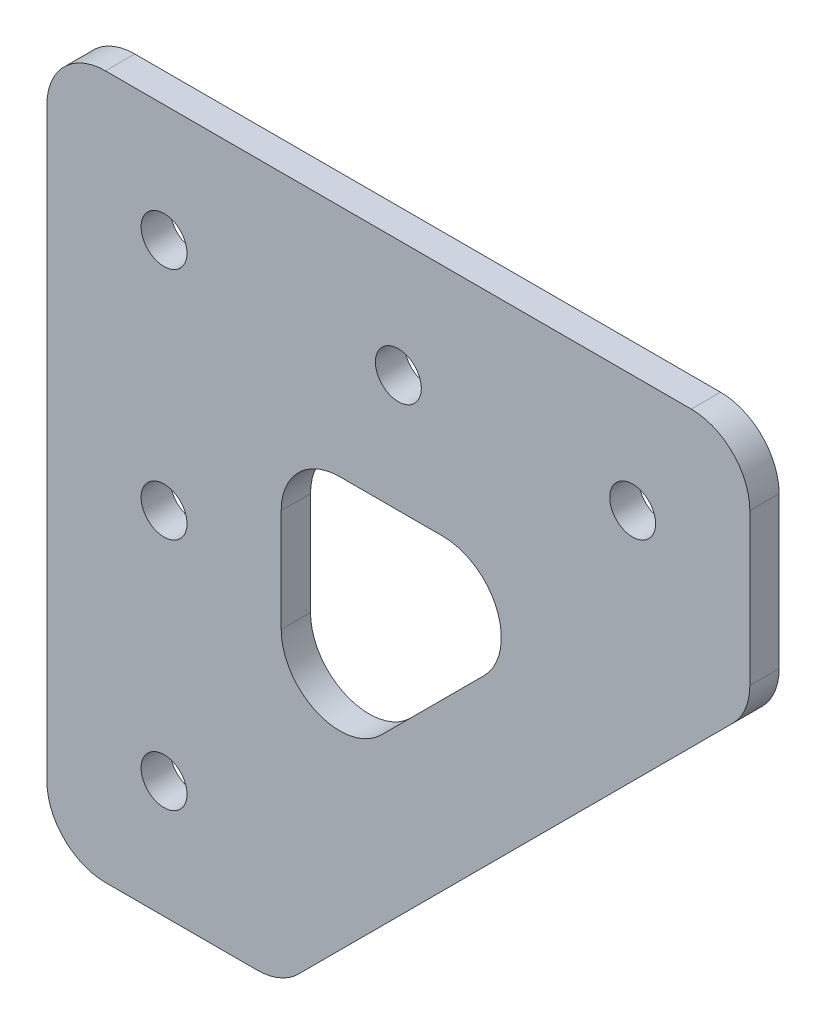
ISO-10303-21;
HEADER;
FILE_DESCRIPTION(('STEP AP214'),'2;1');
FILE_NAME('part.step','',(''),(''),'','','');
FILE_SCHEMA(('AUTOMOTIVE_DESIGN { 1 0 10303 214 1 1 1 1 }'));
ENDSEC;
DATA;
#1=APPLICATION_CONTEXT('core data for automotive mechanical design processes');
#2=APPLICATION_PROTOCOL_DEFINITION('international standard','automotive_design',2000,#1);
#3=PRODUCT_CONTEXT('',#1,'mechanical');
#4=PRODUCT('Part','Part','',(#3));
#5=PRODUCT_RELATED_PRODUCT_CATEGORY('part','',(#4));
#6=PRODUCT_DEFINITION_FORMATION('','',#4);
#7=PRODUCT_DEFINITION_CONTEXT('part definition',#1,'design');
#8=PRODUCT_DEFINITION('design','',#6,#7);
#9=PRODUCT_DEFINITION_SHAPE('','',#8);
#10=(LENGTH_UNIT() NAMED_UNIT(*) SI_UNIT(.MILLI.,.METRE.));
#11=(NAMED_UNIT(*) PLANE_ANGLE_UNIT() SI_UNIT($,.RADIAN.));
#12=(NAMED_UNIT(*) SI_UNIT($,.STERADIAN.) SOLID_ANGLE_UNIT());
#13=UNCERTAINTY_MEASURE_WITH_UNIT(LENGTH_MEASURE(1.E-05),#10,'distance_accuracy_value','');
#14=(GEOMETRIC_REPRESENTATION_CONTEXT(3) GLOBAL_UNCERTAINTY_ASSIGNED_CONTEXT((#13)) GLOBAL_UNIT_ASSIGNED_CONTEXT((#10,
#11,#12)) REPRESENTATION_CONTEXT('',''));
#15=CARTESIAN_POINT('',(0.,0.,0.));
#16=DIRECTION('',(0.,0.,1.));
#17=DIRECTION('',(1.,0.,0.));
#18=AXIS2_PLACEMENT_3D('',#15,#16,#17);
#19=CARTESIAN_POINT('',(0.,50.8,-3.175));
#20=DIRECTION('',(0.,1.,0.));
#21=DIRECTION('',(-1.,0.,0.));
#22=AXIS2_PLACEMENT_3D('',#19,#20,#21);
#23=PLANE('',#22);
#24=DIRECTION('',(-1.,0.,0.));
#25=VECTOR('',#24,1.);
#26=CARTESIAN_POINT('',(0.,50.8,-3.175));
#27=LINE('',#26,#25);
#28=CARTESIAN_POINT('',(42.9092316367925,50.8,-3.175));
#29=VERTEX_POINT('',#28);
#30=CARTESIAN_POINT('',(31.75,50.8,-3.175));
#31=VERTEX_POINT('',#30);
#32=EDGE_CURVE('E174',#29,#31,#27,.T.);
#33=ORIENTED_EDGE('',*,*,#32,.F.);
#34=DIRECTION('',(0.,0.,1.));
#35=VECTOR('',#34,1.);
#36=CARTESIAN_POINT('',(42.9092316367925,50.8,-3.175));
#37=LINE('',#36,#35);
#38=CARTESIAN_POINT('',(42.9092316367925,50.8,0.));
#39=VERTEX_POINT('',#38);
#40=EDGE_CURVE('E159',#29,#39,#37,.T.);
#41=ORIENTED_EDGE('',*,*,#40,.T.);
#42=DIRECTION('',(-1.,0.,0.));
#43=VECTOR('',#42,1.);
#44=CARTESIAN_POINT('',(0.,50.8,0.));
#45=LINE('',#44,#43);
#46=CARTESIAN_POINT('',(31.75,50.8,0.));
#47=VERTEX_POINT('',#46);
#48=EDGE_CURVE('E171',#39,#47,#45,.T.);
#49=ORIENTED_EDGE('',*,*,#48,.T.);
#50=DIRECTION('',(0.,0.,1.));
#51=VECTOR('',#50,1.);
#52=CARTESIAN_POINT('',(31.75,50.8,-3.175));
#53=LINE('',#52,#51);
#54=EDGE_CURVE('E176',#47,#31,#53,.F.);
#55=ORIENTED_EDGE('',*,*,#54,.T.);
#56=EDGE_LOOP('',(#33,#41,#49,#55));
#57=FACE_BOUND('',#56,.T.);
#58=ADVANCED_FACE('F41',(#57),#23,.F.);
#59=CARTESIAN_POINT('',(25.4,0.,-3.175));
#60=DIRECTION('',(-1.,0.,0.));
#61=DIRECTION('',(0.,-1.,0.));
#62=AXIS2_PLACEMENT_3D('',#59,#60,#61);
#63=PLANE('',#62);
#64=DIRECTION('',(0.,-1.,0.));
#65=VECTOR('',#64,1.);
#66=CARTESIAN_POINT('',(25.4,0.,0.));
#67=LINE('',#66,#65);
#68=CARTESIAN_POINT('',(25.4,44.45,0.));
#69=VERTEX_POINT('',#68);
#70=CARTESIAN_POINT('',(25.4,33.2907683632074,0.));
#71=VERTEX_POINT('',#70);
#72=EDGE_CURVE('E183',#69,#71,#67,.T.);
#73=ORIENTED_EDGE('',*,*,#72,.T.);
#74=DIRECTION('',(0.,0.,1.));
#75=VECTOR('',#74,1.);
#76=CARTESIAN_POINT('',(25.4,33.2907683632074,-3.175));
#77=LINE('',#76,#75);
#78=CARTESIAN_POINT('',(25.4,33.2907683632074,-3.175));
#79=VERTEX_POINT('',#78);
#80=EDGE_CURVE('E201',#71,#79,#77,.F.);
#81=ORIENTED_EDGE('',*,*,#80,.T.);
#82=DIRECTION('',(0.,-1.,0.));
#83=VECTOR('',#82,1.);
#84=CARTESIAN_POINT('',(25.4,0.,-3.175));
#85=LINE('',#84,#83);
#86=CARTESIAN_POINT('',(25.4,44.45,-3.175));
#87=VERTEX_POINT('',#86);
#88=EDGE_CURVE('E193',#87,#79,#85,.T.);
#89=ORIENTED_EDGE('',*,*,#88,.F.);
#90=DIRECTION('',(0.,0.,1.));
#91=VECTOR('',#90,1.);
#92=CARTESIAN_POINT('',(25.4,44.45,0.));
#93=LINE('',#92,#91);
#94=EDGE_CURVE('E198',#87,#69,#93,.T.);
#95=ORIENTED_EDGE('',*,*,#94,.T.);
#96=EDGE_LOOP('',(#73,#81,#89,#95));
#97=FACE_BOUND('',#96,.T.);
#98=ADVANCED_FACE('F265',(#97),#63,.F.);
#99=CARTESIAN_POINT('',(0.,0.,-3.175));
#100=DIRECTION('',(0.,1.,0.));
#101=DIRECTION('',(-1.,0.,0.));
#102=AXIS2_PLACEMENT_3D('',#99,#100,#101);
#103=PLANE('',#102);
#104=DIRECTION('',(-1.,0.,0.));
#105=VECTOR('',#104,1.);
#106=CARTESIAN_POINT('',(0.,0.,-3.175));
#107=LINE('',#106,#105);
#108=CARTESIAN_POINT('',(22.7697438789308,0.,-3.175));
#109=VERTEX_POINT('',#108);
#110=CARTESIAN_POINT('',(6.35,0.,-3.175));
#111=VERTEX_POINT('',#110);
#112=EDGE_CURVE('E192',#109,#111,#107,.T.);
#113=ORIENTED_EDGE('',*,*,#112,.F.);
#114=DIRECTION('',(0.,0.,1.));
#115=VECTOR('',#114,1.);
#116=CARTESIAN_POINT('',(22.7697438789308,0.,0.));
#117=LINE('',#116,#115);
#118=CARTESIAN_POINT('',(22.7697438789308,0.,0.));
#119=VERTEX_POINT('',#118);
#120=EDGE_CURVE('E205',#109,#119,#117,.T.);
#121=ORIENTED_EDGE('',*,*,#120,.T.);
#122=DIRECTION('',(-1.,0.,0.));
#123=VECTOR('',#122,1.);
#124=CARTESIAN_POINT('',(0.,0.,0.));
#125=LINE('',#124,#123);
#126=CARTESIAN_POINT('',(6.35,0.,0.));
#127=VERTEX_POINT('',#126);
#128=EDGE_CURVE('E278',#119,#127,#125,.T.);
#129=ORIENTED_EDGE('',*,*,#128,.T.);
#130=DIRECTION('',(0.,0.,1.));
#131=VECTOR('',#130,1.);
#132=CARTESIAN_POINT('',(6.35,0.,-3.175));
#133=LINE('',#132,#131);
#134=EDGE_CURVE('E203',#127,#111,#133,.F.);
#135=ORIENTED_EDGE('',*,*,#134,.T.);
#136=EDGE_LOOP('',(#113,#121,#129,#135));
#137=FACE_BOUND('',#136,.T.);
#138=ADVANCED_FACE('F332',(#137),#103,.F.);
#139=CARTESIAN_POINT('',(0.,0.,-3.175));
#140=DIRECTION('',(1.,0.,0.));
#141=DIRECTION('',(0.,0.,-1.));
#142=AXIS2_PLACEMENT_3D('',#139,#140,#141);
#143=PLANE('',#142);
#144=DIRECTION('',(0.,1.,0.));
#145=VECTOR('',#144,1.);
#146=CARTESIAN_POINT('',(0.,0.,-3.175));
#147=LINE('',#146,#145);
#148=CARTESIAN_POINT('',(0.,6.35,-3.175));
#149=VERTEX_POINT('',#148);
#150=CARTESIAN_POINT('',(0.,69.85,-3.175));
#151=VERTEX_POINT('',#150);
#152=EDGE_CURVE('E270',#149,#151,#147,.T.);
#153=ORIENTED_EDGE('',*,*,#152,.F.);
#154=DIRECTION('',(0.,0.,1.));
#155=VECTOR('',#154,1.);
#156=CARTESIAN_POINT('',(0.,6.35,-3.175));
#157=LINE('',#156,#155);
#158=CARTESIAN_POINT('',(0.,6.35,0.));
#159=VERTEX_POINT('',#158);
#160=EDGE_CURVE('E166',#149,#159,#157,.T.);
#161=ORIENTED_EDGE('',*,*,#160,.T.);
#162=DIRECTION('',(0.,1.,0.));
#163=VECTOR('',#162,1.);
#164=CARTESIAN_POINT('',(0.,0.,0.));
#165=LINE('',#164,#163);
#166=CARTESIAN_POINT('',(0.,69.85,0.));
#167=VERTEX_POINT('',#166);
#168=EDGE_CURVE('E181',#159,#167,#165,.T.);
#169=ORIENTED_EDGE('',*,*,#168,.T.);
#170=DIRECTION('',(0.,0.,1.));
#171=VECTOR('',#170,1.);
#172=CARTESIAN_POINT('',(0.,69.85,-3.175));
#173=LINE('',#172,#171);
#174=EDGE_CURVE('E241',#167,#151,#173,.F.);
#175=ORIENTED_EDGE('',*,*,#174,.T.);
#176=EDGE_LOOP('',(#153,#161,#169,#175));
#177=FACE_BOUND('',#176,.T.);
#178=ADVANCED_FACE('F324',(#177),#143,.F.);
#179=CARTESIAN_POINT('',(0.,76.2,-3.175));
#180=DIRECTION('',(0.,-1.,0.));
#181=DIRECTION('',(0.,0.,-1.));
#182=AXIS2_PLACEMENT_3D('',#179,#180,#181);
#183=PLANE('',#182);
#184=DIRECTION('',(1.,0.,0.));
#185=VECTOR('',#184,1.);
#186=CARTESIAN_POINT('',(0.,76.2,0.));
#187=LINE('',#186,#185);
#188=CARTESIAN_POINT('',(6.35,76.2,0.));
#189=VERTEX_POINT('',#188);
#190=CARTESIAN_POINT('',(69.85,76.2,0.));
#191=VERTEX_POINT('',#190);
#192=EDGE_CURVE('E186',#189,#191,#187,.T.);
#193=ORIENTED_EDGE('',*,*,#192,.T.);
#194=DIRECTION('',(0.,0.,1.));
#195=VECTOR('',#194,1.);
#196=CARTESIAN_POINT('',(69.85,76.2,-3.175));
#197=LINE('',#196,#195);
#198=CARTESIAN_POINT('',(69.85,76.2,-3.175));
#199=VERTEX_POINT('',#198);
#200=EDGE_CURVE('E239',#191,#199,#197,.F.);
#201=ORIENTED_EDGE('',*,*,#200,.T.);
#202=DIRECTION('',(1.,0.,0.));
#203=VECTOR('',#202,1.);
#204=CARTESIAN_POINT('',(0.,76.2,-3.175));
#205=LINE('',#204,#203);
#206=CARTESIAN_POINT('',(6.35,76.2,-3.175));
#207=VERTEX_POINT('',#206);
#208=EDGE_CURVE('E273',#207,#199,#205,.T.);
#209=ORIENTED_EDGE('',*,*,#208,.F.);
#210=DIRECTION('',(0.,0.,1.));
#211=VECTOR('',#210,1.);
#212=CARTESIAN_POINT('',(6.35,76.2,-3.175));
#213=LINE('',#212,#211);
#214=EDGE_CURVE('E236',#207,#189,#213,.T.);
#215=ORIENTED_EDGE('',*,*,#214,.T.);
#216=EDGE_LOOP('',(#193,#201,#209,#215));
#217=FACE_BOUND('',#216,.T.);
#218=ADVANCED_FACE('F290',(#217),#183,.F.);
#219=CARTESIAN_POINT('',(76.2,0.,-3.175));
#220=DIRECTION('',(-1.,0.,0.));
#221=DIRECTION('',(0.,0.,1.));
#222=AXIS2_PLACEMENT_3D('',#219,#220,#221);
#223=PLANE('',#222);
#224=DIRECTION('',(0.,-1.,0.));
#225=VECTOR('',#224,1.);
#226=CARTESIAN_POINT('',(76.2,0.,0.));
#227=LINE('',#226,#225);
#228=CARTESIAN_POINT('',(76.2,69.85,0.));
#229=VERTEX_POINT('',#228);
#230=CARTESIAN_POINT('',(76.2,53.4302561210692,0.));
#231=VERTEX_POINT('',#230);
#232=EDGE_CURVE('E285',#229,#231,#227,.T.);
#233=ORIENTED_EDGE('',*,*,#232,.T.);
#234=DIRECTION('',(0.,0.,1.));
#235=VECTOR('',#234,1.);
#236=CARTESIAN_POINT('',(76.2,53.4302561210692,-3.175));
#237=LINE('',#236,#235);
#238=CARTESIAN_POINT('',(76.2,53.4302561210692,-3.175));
#239=VERTEX_POINT('',#238);
#240=EDGE_CURVE('E56',#231,#239,#237,.F.);
#241=ORIENTED_EDGE('',*,*,#240,.T.);
#242=DIRECTION('',(0.,-1.,0.));
#243=VECTOR('',#242,1.);
#244=CARTESIAN_POINT('',(76.2,0.,-3.175));
#245=LINE('',#244,#243);
#246=CARTESIAN_POINT('',(76.2,69.85,-3.175));
#247=VERTEX_POINT('',#246);
#248=EDGE_CURVE('E299',#247,#239,#245,.T.);
#249=ORIENTED_EDGE('',*,*,#248,.F.);
#250=DIRECTION('',(0.,0.,1.));
#251=VECTOR('',#250,1.);
#252=CARTESIAN_POINT('',(76.2,69.85,-3.175));
#253=LINE('',#252,#251);
#254=EDGE_CURVE('E232',#247,#229,#253,.T.);
#255=ORIENTED_EDGE('',*,*,#254,.T.);
#256=EDGE_LOOP('',(#233,#241,#249,#255));
#257=FACE_BOUND('',#256,.T.);
#258=ADVANCED_FACE('F298',(#257),#223,.F.);
#259=CARTESIAN_POINT('',(12.7,-12.7,-3.175));
#260=DIRECTION('',(0.707106781186548,-0.707106781186548,0.));
#261=DIRECTION('',(0.707106781186548,0.707106781186548,0.));
#262=AXIS2_PLACEMENT_3D('',#259,#260,#261);
#263=PLANE('',#262);
#264=DIRECTION('',(0.707106781186548,0.707106781186548,0.));
#265=VECTOR('',#264,1.);
#266=CARTESIAN_POINT('',(12.7,-12.7,0.));
#267=LINE('',#266,#265);
#268=CARTESIAN_POINT('',(27.2598719394654,1.85987193946543,0.));
#269=VERTEX_POINT('',#268);
#270=CARTESIAN_POINT('',(74.3401280605346,48.9401280605346,0.));
#271=VERTEX_POINT('',#270);
#272=EDGE_CURVE('E281',#269,#271,#267,.T.);
#273=ORIENTED_EDGE('',*,*,#272,.F.);
#274=DIRECTION('',(0.,0.,1.));
#275=VECTOR('',#274,1.);
#276=CARTESIAN_POINT('',(27.2598719394654,1.85987193946542,-3.175));
#277=LINE('',#276,#275);
#278=CARTESIAN_POINT('',(27.2598719394654,1.85987193946543,-3.175));
#279=VERTEX_POINT('',#278);
#280=EDGE_CURVE('E221',#269,#279,#277,.F.);
#281=ORIENTED_EDGE('',*,*,#280,.T.);
#282=DIRECTION('',(0.707106781186548,0.707106781186548,0.));
#283=VECTOR('',#282,1.);
#284=CARTESIAN_POINT('',(12.7,-12.7,-3.175));
#285=LINE('',#284,#283);
#286=CARTESIAN_POINT('',(74.3401280605346,48.9401280605346,-3.175));
#287=VERTEX_POINT('',#286);
#288=EDGE_CURVE('E311',#279,#287,#285,.T.);
#289=ORIENTED_EDGE('',*,*,#288,.T.);
#290=DIRECTION('',(0.,0.,1.));
#291=VECTOR('',#290,1.);
#292=CARTESIAN_POINT('',(74.3401280605346,48.9401280605346,0.));
#293=LINE('',#292,#291);
#294=EDGE_CURVE('E218',#287,#271,#293,.T.);
#295=ORIENTED_EDGE('',*,*,#294,.T.);
#296=EDGE_LOOP('',(#273,#281,#289,#295));
#297=FACE_BOUND('',#296,.T.);
#298=ADVANCED_FACE('F308',(#297),#263,.T.);
#299=CARTESIAN_POINT('',(3.71974387893086,-3.71974387893086,-3.175));
#300=DIRECTION('',(-0.707106781186548,0.707106781186547,0.));
#301=DIRECTION('',(-0.707106781186547,-0.707106781186548,0.));
#302=AXIS2_PLACEMENT_3D('',#299,#300,#301);
#303=PLANE('',#302);
#304=DIRECTION('',(-0.707106781186547,-0.707106781186548,0.));
#305=VECTOR('',#304,1.);
#306=CARTESIAN_POINT('',(3.71974387893086,-3.71974387893086,0.));
#307=LINE('',#306,#305);
#308=CARTESIAN_POINT('',(47.3993596973271,39.9598719394654,0.));
#309=VERTEX_POINT('',#308);
#310=CARTESIAN_POINT('',(36.2401280605346,28.8006403026729,0.));
#311=VERTEX_POINT('',#310);
#312=EDGE_CURVE('E180',#309,#311,#307,.T.);
#313=ORIENTED_EDGE('',*,*,#312,.F.);
#314=DIRECTION('',(0.,0.,1.));
#315=VECTOR('',#314,1.);
#316=CARTESIAN_POINT('',(47.3993596973271,39.9598719394654,-3.175));
#317=LINE('',#316,#315);
#318=CARTESIAN_POINT('',(47.3993596973271,39.9598719394654,-3.175));
#319=VERTEX_POINT('',#318);
#320=EDGE_CURVE('E160',#309,#319,#317,.F.);
#321=ORIENTED_EDGE('',*,*,#320,.T.);
#322=DIRECTION('',(-0.707106781186547,-0.707106781186548,0.));
#323=VECTOR('',#322,1.);
#324=CARTESIAN_POINT('',(3.71974387893086,-3.71974387893086,-3.175));
#325=LINE('',#324,#323);
#326=CARTESIAN_POINT('',(36.2401280605346,28.8006403026729,-3.175));
#327=VERTEX_POINT('',#326);
#328=EDGE_CURVE('E255',#319,#327,#325,.T.);
#329=ORIENTED_EDGE('',*,*,#328,.T.);
#330=DIRECTION('',(0.,0.,1.));
#331=VECTOR('',#330,1.);
#332=CARTESIAN_POINT('',(36.2401280605346,28.8006403026729,-3.175));
#333=LINE('',#332,#331);
#334=EDGE_CURVE('E175',#327,#311,#333,.T.);
#335=ORIENTED_EDGE('',*,*,#334,.T.);
#336=EDGE_LOOP('',(#313,#321,#329,#335));
#337=FACE_BOUND('',#336,.T.);
#338=ADVANCED_FACE('F261',(#337),#303,.T.);
#339=CARTESIAN_POINT('',(0.,0.,-3.175));
#340=DIRECTION('',(0.,0.,1.));
#341=DIRECTION('',(1.,0.,0.));
#342=AXIS2_PLACEMENT_3D('',#339,#340,#341);
#343=PLANE('',#342);
#344=CARTESIAN_POINT('',(12.7,12.7,-3.175));
#345=DIRECTION('',(0.,0.,1.));
#346=DIRECTION('',(1.,0.,0.));
#347=AXIS2_PLACEMENT_3D('',#344,#345,#346);
#348=CIRCLE('',#347,2.4892);
#349=CARTESIAN_POINT('',(15.1892,12.7,-3.175));
#350=VERTEX_POINT('',#349);
#351=EDGE_CURVE('E528',#350,#350,#348,.T.);
#352=ORIENTED_EDGE('',*,*,#351,.T.);
#353=EDGE_LOOP('',(#352));
#354=FACE_BOUND('',#353,.T.);
#355=CARTESIAN_POINT('',(12.7,38.1,-3.175));
#356=DIRECTION('',(0.,0.,1.));
#357=DIRECTION('',(1.,0.,0.));
#358=AXIS2_PLACEMENT_3D('',#355,#356,#357);
#359=CIRCLE('',#358,2.4892);
#360=CARTESIAN_POINT('',(15.1892,38.1,-3.175));
#361=VERTEX_POINT('',#360);
#362=EDGE_CURVE('E532',#361,#361,#359,.T.);
#363=ORIENTED_EDGE('',*,*,#362,.T.);
#364=EDGE_LOOP('',(#363));
#365=FACE_BOUND('',#364,.T.);
#366=CARTESIAN_POINT('',(63.5,63.5,-3.175));
#367=DIRECTION('',(0.,0.,1.));
#368=DIRECTION('',(1.,0.,0.));
#369=AXIS2_PLACEMENT_3D('',#366,#367,#368);
#370=CIRCLE('',#369,2.4892);
#371=CARTESIAN_POINT('',(65.9892,63.5,-3.175));
#372=VERTEX_POINT('',#371);
#373=EDGE_CURVE('E536',#372,#372,#370,.T.);
#374=ORIENTED_EDGE('',*,*,#373,.T.);
#375=EDGE_LOOP('',(#374));
#376=FACE_BOUND('',#375,.T.);
#377=CARTESIAN_POINT('',(38.1,63.5,-3.175));
#378=DIRECTION('',(0.,0.,1.));
#379=DIRECTION('',(1.,0.,0.));
#380=AXIS2_PLACEMENT_3D('',#377,#378,#379);
#381=CIRCLE('',#380,2.4892);
#382=CARTESIAN_POINT('',(40.5892,63.5,-3.175));
#383=VERTEX_POINT('',#382);
#384=EDGE_CURVE('E540',#383,#383,#381,.T.);
#385=ORIENTED_EDGE('',*,*,#384,.T.);
#386=EDGE_LOOP('',(#385));
#387=FACE_BOUND('',#386,.T.);
#388=CARTESIAN_POINT('',(12.7,63.5,-3.175));
#389=DIRECTION('',(0.,0.,1.));
#390=DIRECTION('',(1.,0.,0.));
#391=AXIS2_PLACEMENT_3D('',#388,#389,#390);
#392=CIRCLE('',#391,2.4892);
#393=CARTESIAN_POINT('',(15.1892,63.5,-3.175));
#394=VERTEX_POINT('',#393);
#395=EDGE_CURVE('E282',#394,#394,#392,.T.);
#396=ORIENTED_EDGE('',*,*,#395,.T.);
#397=EDGE_LOOP('',(#396));
#398=FACE_BOUND('',#397,.T.);
#399=ORIENTED_EDGE('',*,*,#288,.F.);
#400=CARTESIAN_POINT('',(22.7697438789308,6.35,-3.175));
#401=DIRECTION('',(0.,0.,1.));
#402=DIRECTION('',(1.,0.,0.));
#403=AXIS2_PLACEMENT_3D('',#400,#401,#402);
#404=CIRCLE('',#403,6.35);
#405=EDGE_CURVE('E230',#279,#109,#404,.F.);
#406=ORIENTED_EDGE('',*,*,#405,.T.);
#407=ORIENTED_EDGE('',*,*,#112,.T.);
#408=CARTESIAN_POINT('',(6.35,6.35,-3.175));
#409=DIRECTION('',(0.,0.,1.));
#410=DIRECTION('',(1.,0.,0.));
#411=AXIS2_PLACEMENT_3D('',#408,#409,#410);
#412=CIRCLE('',#411,6.35);
#413=EDGE_CURVE('E225',#111,#149,#412,.F.);
#414=ORIENTED_EDGE('',*,*,#413,.T.);
#415=ORIENTED_EDGE('',*,*,#152,.T.);
#416=CARTESIAN_POINT('',(6.35,69.85,-3.175));
#417=DIRECTION('',(0.,0.,1.));
#418=DIRECTION('',(1.,0.,0.));
#419=AXIS2_PLACEMENT_3D('',#416,#417,#418);
#420=CIRCLE('',#419,6.35);
#421=EDGE_CURVE('E223',#151,#207,#420,.F.);
#422=ORIENTED_EDGE('',*,*,#421,.T.);
#423=ORIENTED_EDGE('',*,*,#208,.T.);
#424=CARTESIAN_POINT('',(69.85,69.85,-3.175));
#425=DIRECTION('',(0.,0.,1.));
#426=DIRECTION('',(1.,0.,0.));
#427=AXIS2_PLACEMENT_3D('',#424,#425,#426);
#428=CIRCLE('',#427,6.35);
#429=EDGE_CURVE('E63',#199,#247,#428,.F.);
#430=ORIENTED_EDGE('',*,*,#429,.T.);
#431=ORIENTED_EDGE('',*,*,#248,.T.);
#432=CARTESIAN_POINT('',(69.85,53.4302561210692,-3.175));
#433=DIRECTION('',(0.,0.,1.));
#434=DIRECTION('',(1.,0.,0.));
#435=AXIS2_PLACEMENT_3D('',#432,#433,#434);
#436=CIRCLE('',#435,6.35);
#437=EDGE_CURVE('E228',#239,#287,#436,.F.);
#438=ORIENTED_EDGE('',*,*,#437,.T.);
#439=EDGE_LOOP('',(#399,#406,#407,#414,#415,#422,#423,#430,#431,#438));
#440=FACE_BOUND('',#439,.T.);
#441=ORIENTED_EDGE('',*,*,#328,.F.);
#442=CARTESIAN_POINT('',(42.9092316367925,44.45,-3.175));
#443=DIRECTION('',(0.,0.,1.));
#444=DIRECTION('',(1.,0.,0.));
#445=AXIS2_PLACEMENT_3D('',#442,#443,#444);
#446=CIRCLE('',#445,6.35);
#447=EDGE_CURVE('E165',#319,#29,#446,.T.);
#448=ORIENTED_EDGE('',*,*,#447,.T.);
#449=ORIENTED_EDGE('',*,*,#32,.T.);
#450=CARTESIAN_POINT('',(31.75,44.45,-3.175));
#451=DIRECTION('',(0.,0.,1.));
#452=DIRECTION('',(1.,0.,0.));
#453=AXIS2_PLACEMENT_3D('',#450,#451,#452);
#454=CIRCLE('',#453,6.35);
#455=EDGE_CURVE('E11',#31,#87,#454,.T.);
#456=ORIENTED_EDGE('',*,*,#455,.T.);
#457=ORIENTED_EDGE('',*,*,#88,.T.);
#458=CARTESIAN_POINT('',(31.75,33.2907683632074,-3.175));
#459=DIRECTION('',(0.,0.,1.));
#460=DIRECTION('',(1.,0.,0.));
#461=AXIS2_PLACEMENT_3D('',#458,#459,#460);
#462=CIRCLE('',#461,6.35);
#463=EDGE_CURVE('E248',#79,#327,#462,.T.);
#464=ORIENTED_EDGE('',*,*,#463,.T.);
#465=EDGE_LOOP('',(#441,#448,#449,#456,#457,#464));
#466=FACE_BOUND('',#465,.T.);
#467=ADVANCED_FACE('F254',(#354,#365,#376,#387,#398,#440,#466),#343,.F.);
#468=CARTESIAN_POINT('',(0.,0.,0.));
#469=DIRECTION('',(0.,0.,1.));
#470=DIRECTION('',(1.,0.,0.));
#471=AXIS2_PLACEMENT_3D('',#468,#469,#470);
#472=PLANE('',#471);
#473=CARTESIAN_POINT('',(12.7,12.7,0.));
#474=DIRECTION('',(0.,0.,1.));
#475=DIRECTION('',(1.,0.,0.));
#476=AXIS2_PLACEMENT_3D('',#473,#474,#475);
#477=CIRCLE('',#476,2.4892);
#478=CARTESIAN_POINT('',(15.1892,12.7,0.));
#479=VERTEX_POINT('',#478);
#480=EDGE_CURVE('E549',#479,#479,#477,.T.);
#481=ORIENTED_EDGE('',*,*,#480,.F.);
#482=EDGE_LOOP('',(#481));
#483=FACE_BOUND('',#482,.T.);
#484=CARTESIAN_POINT('',(12.7,38.1,0.));
#485=DIRECTION('',(0.,0.,1.));
#486=DIRECTION('',(1.,0.,0.));
#487=AXIS2_PLACEMENT_3D('',#484,#485,#486);
#488=CIRCLE('',#487,2.4892);
#489=CARTESIAN_POINT('',(15.1892,38.1,0.));
#490=VERTEX_POINT('',#489);
#491=EDGE_CURVE('E553',#490,#490,#488,.T.);
#492=ORIENTED_EDGE('',*,*,#491,.F.);
#493=EDGE_LOOP('',(#492));
#494=FACE_BOUND('',#493,.T.);
#495=CARTESIAN_POINT('',(63.5,63.5,0.));
#496=DIRECTION('',(0.,0.,1.));
#497=DIRECTION('',(1.,0.,0.));
#498=AXIS2_PLACEMENT_3D('',#495,#496,#497);
#499=CIRCLE('',#498,2.4892);
#500=CARTESIAN_POINT('',(65.9892,63.5,0.));
#501=VERTEX_POINT('',#500);
#502=EDGE_CURVE('E557',#501,#501,#499,.T.);
#503=ORIENTED_EDGE('',*,*,#502,.F.);
#504=EDGE_LOOP('',(#503));
#505=FACE_BOUND('',#504,.T.);
#506=CARTESIAN_POINT('',(38.1,63.5,0.));
#507=DIRECTION('',(0.,0.,1.));
#508=DIRECTION('',(1.,0.,0.));
#509=AXIS2_PLACEMENT_3D('',#506,#507,#508);
#510=CIRCLE('',#509,2.4892);
#511=CARTESIAN_POINT('',(40.5892,63.5,0.));
#512=VERTEX_POINT('',#511);
#513=EDGE_CURVE('E546',#512,#512,#510,.T.);
#514=ORIENTED_EDGE('',*,*,#513,.F.);
#515=EDGE_LOOP('',(#514));
#516=FACE_BOUND('',#515,.T.);
#517=CARTESIAN_POINT('',(12.7,63.5,0.));
#518=DIRECTION('',(0.,0.,1.));
#519=DIRECTION('',(1.,0.,0.));
#520=AXIS2_PLACEMENT_3D('',#517,#518,#519);
#521=CIRCLE('',#520,2.4892);
#522=CARTESIAN_POINT('',(15.1892,63.5,0.));
#523=VERTEX_POINT('',#522);
#524=EDGE_CURVE('E543',#523,#523,#521,.T.);
#525=ORIENTED_EDGE('',*,*,#524,.F.);
#526=EDGE_LOOP('',(#525));
#527=FACE_BOUND('',#526,.T.);
#528=ORIENTED_EDGE('',*,*,#128,.F.);
#529=CARTESIAN_POINT('',(22.7697438789308,6.35,0.));
#530=DIRECTION('',(0.,0.,1.));
#531=DIRECTION('',(1.,0.,0.));
#532=AXIS2_PLACEMENT_3D('',#529,#530,#531);
#533=CIRCLE('',#532,6.35);
#534=EDGE_CURVE('E216',#119,#269,#533,.T.);
#535=ORIENTED_EDGE('',*,*,#534,.T.);
#536=ORIENTED_EDGE('',*,*,#272,.T.);
#537=CARTESIAN_POINT('',(69.85,53.4302561210692,0.));
#538=DIRECTION('',(0.,0.,1.));
#539=DIRECTION('',(1.,0.,0.));
#540=AXIS2_PLACEMENT_3D('',#537,#538,#539);
#541=CIRCLE('',#540,6.35);
#542=EDGE_CURVE('E214',#271,#231,#541,.T.);
#543=ORIENTED_EDGE('',*,*,#542,.T.);
#544=ORIENTED_EDGE('',*,*,#232,.F.);
#545=CARTESIAN_POINT('',(69.85,69.85,0.));
#546=DIRECTION('',(0.,0.,1.));
#547=DIRECTION('',(1.,0.,0.));
#548=AXIS2_PLACEMENT_3D('',#545,#546,#547);
#549=CIRCLE('',#548,6.35);
#550=EDGE_CURVE('E212',#229,#191,#549,.T.);
#551=ORIENTED_EDGE('',*,*,#550,.T.);
#552=ORIENTED_EDGE('',*,*,#192,.F.);
#553=CARTESIAN_POINT('',(6.35,69.85,0.));
#554=DIRECTION('',(0.,0.,1.));
#555=DIRECTION('',(1.,0.,0.));
#556=AXIS2_PLACEMENT_3D('',#553,#554,#555);
#557=CIRCLE('',#556,6.35);
#558=EDGE_CURVE('E208',#189,#167,#557,.T.);
#559=ORIENTED_EDGE('',*,*,#558,.T.);
#560=ORIENTED_EDGE('',*,*,#168,.F.);
#561=CARTESIAN_POINT('',(6.35,6.35,0.));
#562=DIRECTION('',(0.,0.,1.));
#563=DIRECTION('',(1.,0.,0.));
#564=AXIS2_PLACEMENT_3D('',#561,#562,#563);
#565=CIRCLE('',#564,6.35);
#566=EDGE_CURVE('E210',#159,#127,#565,.T.);
#567=ORIENTED_EDGE('',*,*,#566,.T.);
#568=EDGE_LOOP('',(#528,#535,#536,#543,#544,#551,#552,#559,#560,#567));
#569=FACE_BOUND('',#568,.T.);
#570=ORIENTED_EDGE('',*,*,#48,.F.);
#571=CARTESIAN_POINT('',(42.9092316367925,44.45,0.));
#572=DIRECTION('',(0.,0.,1.));
#573=DIRECTION('',(1.,0.,0.));
#574=AXIS2_PLACEMENT_3D('',#571,#572,#573);
#575=CIRCLE('',#574,6.35);
#576=EDGE_CURVE('E155',#39,#309,#575,.F.);
#577=ORIENTED_EDGE('',*,*,#576,.T.);
#578=ORIENTED_EDGE('',*,*,#312,.T.);
#579=CARTESIAN_POINT('',(31.75,33.2907683632074,0.));
#580=DIRECTION('',(0.,0.,1.));
#581=DIRECTION('',(1.,0.,0.));
#582=AXIS2_PLACEMENT_3D('',#579,#580,#581);
#583=CIRCLE('',#582,6.35);
#584=EDGE_CURVE('E246',#311,#71,#583,.F.);
#585=ORIENTED_EDGE('',*,*,#584,.T.);
#586=ORIENTED_EDGE('',*,*,#72,.F.);
#587=CARTESIAN_POINT('',(31.75,44.45,0.));
#588=DIRECTION('',(0.,0.,1.));
#589=DIRECTION('',(1.,0.,0.));
#590=AXIS2_PLACEMENT_3D('',#587,#588,#589);
#591=CIRCLE('',#590,6.35);
#592=EDGE_CURVE('E49',#69,#47,#591,.F.);
#593=ORIENTED_EDGE('',*,*,#592,.T.);
#594=EDGE_LOOP('',(#570,#577,#578,#585,#586,#593));
#595=FACE_BOUND('',#594,.T.);
#596=ADVANCED_FACE('F178',(#483,#494,#505,#516,#527,#569,#595),#472,.T.);
#597=CARTESIAN_POINT('',(12.7,63.5,-3.175));
#598=DIRECTION('',(0.,0.,1.));
#599=DIRECTION('',(1.,0.,0.));
#600=AXIS2_PLACEMENT_3D('',#597,#598,#599);
#601=CYLINDRICAL_SURFACE('',#600,2.4892);
#602=ORIENTED_EDGE('',*,*,#395,.F.);
#603=EDGE_LOOP('',(#602));
#604=FACE_BOUND('',#603,.T.);
#605=ORIENTED_EDGE('',*,*,#524,.T.);
#606=EDGE_LOOP('',(#605));
#607=FACE_BOUND('',#606,.T.);
#608=ADVANCED_FACE('F449',(#604,#607),#601,.F.);
#609=CARTESIAN_POINT('',(38.1,63.5,-3.175));
#610=DIRECTION('',(0.,0.,1.));
#611=DIRECTION('',(1.,0.,0.));
#612=AXIS2_PLACEMENT_3D('',#609,#610,#611);
#613=CYLINDRICAL_SURFACE('',#612,2.4892);
#614=ORIENTED_EDGE('',*,*,#384,.F.);
#615=EDGE_LOOP('',(#614));
#616=FACE_BOUND('',#615,.T.);
#617=ORIENTED_EDGE('',*,*,#513,.T.);
#618=EDGE_LOOP('',(#617));
#619=FACE_BOUND('',#618,.T.);
#620=ADVANCED_FACE('F440',(#616,#619),#613,.F.);
#621=CARTESIAN_POINT('',(63.5,63.5,-3.175));
#622=DIRECTION('',(0.,0.,1.));
#623=DIRECTION('',(1.,0.,0.));
#624=AXIS2_PLACEMENT_3D('',#621,#622,#623);
#625=CYLINDRICAL_SURFACE('',#624,2.4892);
#626=ORIENTED_EDGE('',*,*,#373,.F.);
#627=EDGE_LOOP('',(#626));
#628=FACE_BOUND('',#627,.T.);
#629=ORIENTED_EDGE('',*,*,#502,.T.);
#630=EDGE_LOOP('',(#629));
#631=FACE_BOUND('',#630,.T.);
#632=ADVANCED_FACE('F431',(#628,#631),#625,.F.);
#633=CARTESIAN_POINT('',(12.7,38.1,-3.175));
#634=DIRECTION('',(0.,0.,1.));
#635=DIRECTION('',(1.,0.,0.));
#636=AXIS2_PLACEMENT_3D('',#633,#634,#635);
#637=CYLINDRICAL_SURFACE('',#636,2.4892);
#638=ORIENTED_EDGE('',*,*,#362,.F.);
#639=EDGE_LOOP('',(#638));
#640=FACE_BOUND('',#639,.T.);
#641=ORIENTED_EDGE('',*,*,#491,.T.);
#642=EDGE_LOOP('',(#641));
#643=FACE_BOUND('',#642,.T.);
#644=ADVANCED_FACE('F422',(#640,#643),#637,.F.);
#645=CARTESIAN_POINT('',(12.7,12.7,-3.175));
#646=DIRECTION('',(0.,0.,1.));
#647=DIRECTION('',(1.,0.,0.));
#648=AXIS2_PLACEMENT_3D('',#645,#646,#647);
#649=CYLINDRICAL_SURFACE('',#648,2.4892);
#650=ORIENTED_EDGE('',*,*,#351,.F.);
#651=EDGE_LOOP('',(#650));
#652=FACE_BOUND('',#651,.T.);
#653=ORIENTED_EDGE('',*,*,#480,.T.);
#654=EDGE_LOOP('',(#653));
#655=FACE_BOUND('',#654,.T.);
#656=ADVANCED_FACE('F365',(#652,#655),#649,.F.);
#657=CARTESIAN_POINT('',(42.9092316367925,44.45,-3.175));
#658=DIRECTION('',(0.,0.,1.));
#659=DIRECTION('',(1.,0.,0.));
#660=AXIS2_PLACEMENT_3D('',#657,#658,#659);
#661=CYLINDRICAL_SURFACE('',#660,6.35);
#662=ORIENTED_EDGE('',*,*,#447,.F.);
#663=ORIENTED_EDGE('',*,*,#320,.F.);
#664=ORIENTED_EDGE('',*,*,#576,.F.);
#665=ORIENTED_EDGE('',*,*,#40,.F.);
#666=EDGE_LOOP('',(#662,#663,#664,#665));
#667=FACE_BOUND('',#666,.T.);
#668=ADVANCED_FACE('F158',(#667),#661,.F.);
#669=CARTESIAN_POINT('',(31.75,33.2907683632074,-3.175));
#670=DIRECTION('',(0.,0.,1.));
#671=DIRECTION('',(1.,0.,0.));
#672=AXIS2_PLACEMENT_3D('',#669,#670,#671);
#673=CYLINDRICAL_SURFACE('',#672,6.35);
#674=ORIENTED_EDGE('',*,*,#463,.F.);
#675=ORIENTED_EDGE('',*,*,#80,.F.);
#676=ORIENTED_EDGE('',*,*,#584,.F.);
#677=ORIENTED_EDGE('',*,*,#334,.F.);
#678=EDGE_LOOP('',(#674,#675,#676,#677));
#679=FACE_BOUND('',#678,.T.);
#680=ADVANCED_FACE('F263',(#679),#673,.F.);
#681=CARTESIAN_POINT('',(31.75,44.45,-3.175));
#682=DIRECTION('',(0.,0.,-1.));
#683=DIRECTION('',(-1.,0.,0.));
#684=AXIS2_PLACEMENT_3D('',#681,#682,#683);
#685=CYLINDRICAL_SURFACE('',#684,6.35);
#686=ORIENTED_EDGE('',*,*,#455,.F.);
#687=ORIENTED_EDGE('',*,*,#54,.F.);
#688=ORIENTED_EDGE('',*,*,#592,.F.);
#689=ORIENTED_EDGE('',*,*,#94,.F.);
#690=EDGE_LOOP('',(#686,#687,#688,#689));
#691=FACE_BOUND('',#690,.T.);
#692=ADVANCED_FACE('F269',(#691),#685,.F.);
#693=CARTESIAN_POINT('',(22.7697438789308,6.35,-3.175));
#694=DIRECTION('',(0.,0.,-1.));
#695=DIRECTION('',(-1.,0.,0.));
#696=AXIS2_PLACEMENT_3D('',#693,#694,#695);
#697=CYLINDRICAL_SURFACE('',#696,6.35);
#698=ORIENTED_EDGE('',*,*,#405,.F.);
#699=ORIENTED_EDGE('',*,*,#280,.F.);
#700=ORIENTED_EDGE('',*,*,#534,.F.);
#701=ORIENTED_EDGE('',*,*,#120,.F.);
#702=EDGE_LOOP('',(#698,#699,#700,#701));
#703=FACE_BOUND('',#702,.T.);
#704=ADVANCED_FACE('F335',(#703),#697,.T.);
#705=CARTESIAN_POINT('',(69.85,53.4302561210692,-3.175));
#706=DIRECTION('',(0.,0.,-1.));
#707=DIRECTION('',(-1.,0.,0.));
#708=AXIS2_PLACEMENT_3D('',#705,#706,#707);
#709=CYLINDRICAL_SURFACE('',#708,6.35);
#710=ORIENTED_EDGE('',*,*,#437,.F.);
#711=ORIENTED_EDGE('',*,*,#240,.F.);
#712=ORIENTED_EDGE('',*,*,#542,.F.);
#713=ORIENTED_EDGE('',*,*,#294,.F.);
#714=EDGE_LOOP('',(#710,#711,#712,#713));
#715=FACE_BOUND('',#714,.T.);
#716=ADVANCED_FACE('F305',(#715),#709,.T.);
#717=CARTESIAN_POINT('',(69.85,69.85,-3.175));
#718=DIRECTION('',(0.,0.,1.));
#719=DIRECTION('',(1.,0.,0.));
#720=AXIS2_PLACEMENT_3D('',#717,#718,#719);
#721=CYLINDRICAL_SURFACE('',#720,6.35);
#722=ORIENTED_EDGE('',*,*,#429,.F.);
#723=ORIENTED_EDGE('',*,*,#200,.F.);
#724=ORIENTED_EDGE('',*,*,#550,.F.);
#725=ORIENTED_EDGE('',*,*,#254,.F.);
#726=EDGE_LOOP('',(#722,#723,#724,#725));
#727=FACE_BOUND('',#726,.T.);
#728=ADVANCED_FACE('F295',(#727),#721,.T.);
#729=CARTESIAN_POINT('',(6.35,6.35,-3.175));
#730=DIRECTION('',(0.,0.,1.));
#731=DIRECTION('',(1.,0.,0.));
#732=AXIS2_PLACEMENT_3D('',#729,#730,#731);
#733=CYLINDRICAL_SURFACE('',#732,6.35);
#734=ORIENTED_EDGE('',*,*,#413,.F.);
#735=ORIENTED_EDGE('',*,*,#134,.F.);
#736=ORIENTED_EDGE('',*,*,#566,.F.);
#737=ORIENTED_EDGE('',*,*,#160,.F.);
#738=EDGE_LOOP('',(#734,#735,#736,#737));
#739=FACE_BOUND('',#738,.T.);
#740=ADVANCED_FACE('F328',(#739),#733,.T.);
#741=CARTESIAN_POINT('',(6.35,69.85,-3.175));
#742=DIRECTION('',(0.,0.,1.));
#743=DIRECTION('',(1.,0.,0.));
#744=AXIS2_PLACEMENT_3D('',#741,#742,#743);
#745=CYLINDRICAL_SURFACE('',#744,6.35);
#746=ORIENTED_EDGE('',*,*,#421,.F.);
#747=ORIENTED_EDGE('',*,*,#174,.F.);
#748=ORIENTED_EDGE('',*,*,#558,.F.);
#749=ORIENTED_EDGE('',*,*,#214,.F.);
#750=EDGE_LOOP('',(#746,#747,#748,#749));
#751=FACE_BOUND('',#750,.T.);
#752=ADVANCED_FACE('F43',(#751),#745,.T.);
#753=CLOSED_SHELL('',(#58,#98,#138,#178,#218,#258,#298,#338,#467,#596,#608,#620,#632,#644,#656,
#668,#680,#692,#704,#716,#728,#740,#752));
#754=MANIFOLD_SOLID_BREP('B2',#753);
#755=ADVANCED_BREP_SHAPE_REPRESENTATION('',(#18,#754),#14);
#756=SHAPE_DEFINITION_REPRESENTATION(#9,#755);
ENDSEC;
END-ISO-10303-21;
